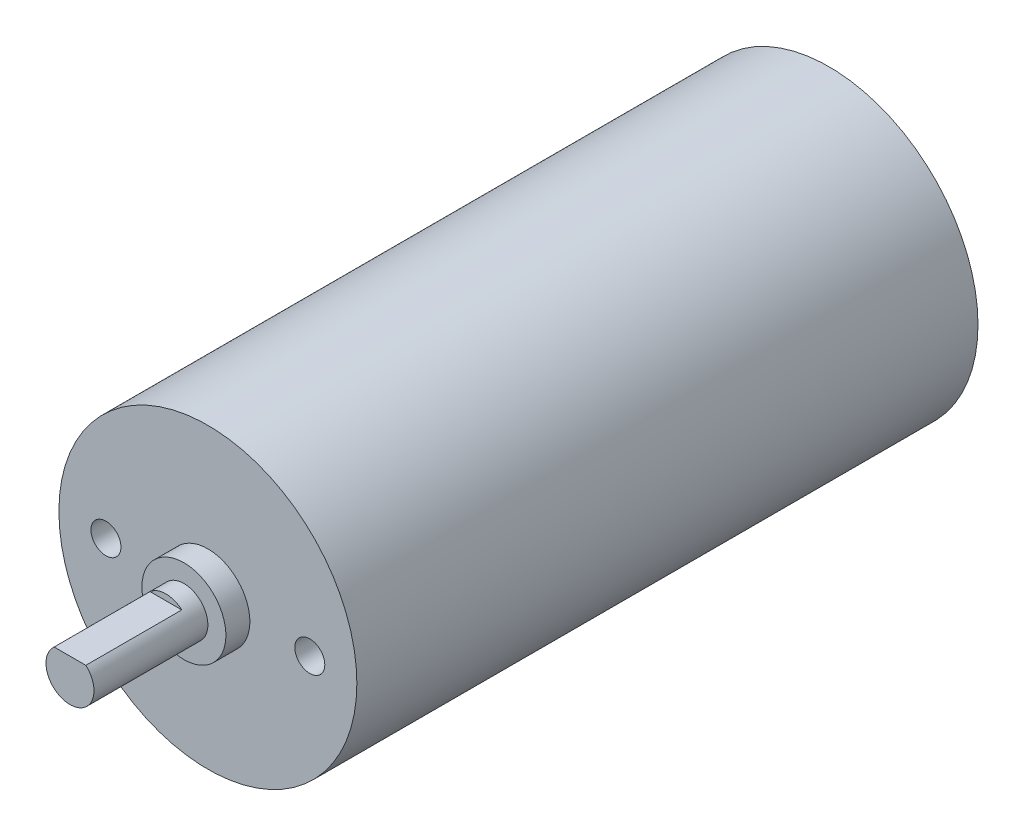
ISO-10303-21;
HEADER;
FILE_DESCRIPTION(('STEP AP214'),'2;1');
FILE_NAME('part.step','',(''),(''),'','','');
FILE_SCHEMA(('AUTOMOTIVE_DESIGN { 1 0 10303 214 1 1 1 1 }'));
ENDSEC;
DATA;
#1=APPLICATION_CONTEXT('core data for automotive mechanical design processes');
#2=APPLICATION_PROTOCOL_DEFINITION('international standard','automotive_design',2000,#1);
#3=PRODUCT_CONTEXT('',#1,'mechanical');
#4=PRODUCT('Part','Part','',(#3));
#5=PRODUCT_RELATED_PRODUCT_CATEGORY('part','',(#4));
#6=PRODUCT_DEFINITION_FORMATION('','',#4);
#7=PRODUCT_DEFINITION_CONTEXT('part definition',#1,'design');
#8=PRODUCT_DEFINITION('design','',#6,#7);
#9=PRODUCT_DEFINITION_SHAPE('','',#8);
#10=(LENGTH_UNIT() NAMED_UNIT(*) SI_UNIT(.MILLI.,.METRE.));
#11=(NAMED_UNIT(*) PLANE_ANGLE_UNIT() SI_UNIT($,.RADIAN.));
#12=(NAMED_UNIT(*) SI_UNIT($,.STERADIAN.) SOLID_ANGLE_UNIT());
#13=UNCERTAINTY_MEASURE_WITH_UNIT(LENGTH_MEASURE(1.E-05),#10,'distance_accuracy_value','');
#14=(GEOMETRIC_REPRESENTATION_CONTEXT(3) GLOBAL_UNCERTAINTY_ASSIGNED_CONTEXT((#13)) GLOBAL_UNIT_ASSIGNED_CONTEXT((#10,
#11,#12)) REPRESENTATION_CONTEXT('',''));
#15=CARTESIAN_POINT('',(0.,0.,0.));
#16=DIRECTION('',(0.,0.,1.));
#17=DIRECTION('',(1.,0.,0.));
#18=AXIS2_PLACEMENT_3D('',#15,#16,#17);
#19=CARTESIAN_POINT('',(0.,0.,8.));
#20=DIRECTION('',(0.,0.,-1.));
#21=DIRECTION('',(-1.,0.,0.));
#22=AXIS2_PLACEMENT_3D('',#19,#20,#21);
#23=CYLINDRICAL_SURFACE('',#22,2.);
#24=DIRECTION('',(0.,0.,-1.));
#25=VECTOR('',#24,1.);
#26=CARTESIAN_POINT('',(-1.3228756555323,1.5,8.));
#27=LINE('',#26,#25);
#28=CARTESIAN_POINT('',(-1.3228756555323,1.5,8.));
#29=VERTEX_POINT('',#28);
#30=CARTESIAN_POINT('',(-1.3228756555323,1.5,0.));
#31=VERTEX_POINT('',#30);
#32=EDGE_CURVE('E57',#29,#31,#27,.T.);
#33=ORIENTED_EDGE('',*,*,#32,.T.);
#34=CARTESIAN_POINT('',(0.,0.,0.));
#35=DIRECTION('',(0.,0.,-1.));
#36=DIRECTION('',(-1.,0.,0.));
#37=AXIS2_PLACEMENT_3D('',#34,#35,#36);
#38=CIRCLE('',#37,2.);
#39=CARTESIAN_POINT('',(1.3228756555323,1.5,0.));
#40=VERTEX_POINT('',#39);
#41=EDGE_CURVE('E107',#31,#40,#38,.T.);
#42=ORIENTED_EDGE('',*,*,#41,.T.);
#43=DIRECTION('',(0.,0.,-1.));
#44=VECTOR('',#43,1.);
#45=CARTESIAN_POINT('',(1.3228756555323,1.5,8.));
#46=LINE('',#45,#44);
#47=CARTESIAN_POINT('',(1.3228756555323,1.5,8.));
#48=VERTEX_POINT('',#47);
#49=EDGE_CURVE('E11',#48,#40,#46,.T.);
#50=ORIENTED_EDGE('',*,*,#49,.F.);
#51=CARTESIAN_POINT('',(0.,0.,8.));
#52=DIRECTION('',(0.,0.,1.));
#53=DIRECTION('',(1.,0.,0.));
#54=AXIS2_PLACEMENT_3D('',#51,#52,#53);
#55=CIRCLE('',#54,2.);
#56=EDGE_CURVE('E116',#29,#48,#55,.T.);
#57=ORIENTED_EDGE('',*,*,#56,.F.);
#58=EDGE_LOOP('',(#33,#42,#50,#57));
#59=FACE_BOUND('',#58,.T.);
#60=CARTESIAN_POINT('',(0.,0.,-1.5));
#61=DIRECTION('',(0.,0.,-1.));
#62=DIRECTION('',(-1.,0.,0.));
#63=AXIS2_PLACEMENT_3D('',#60,#61,#62);
#64=CIRCLE('',#63,2.);
#65=CARTESIAN_POINT('',(-2.,0.,-1.5));
#66=VERTEX_POINT('',#65);
#67=EDGE_CURVE('E110',#66,#66,#64,.T.);
#68=ORIENTED_EDGE('',*,*,#67,.F.);
#69=EDGE_LOOP('',(#68));
#70=FACE_BOUND('',#69,.T.);
#71=ADVANCED_FACE('F49',(#59,#70),#23,.T.);
#72=CARTESIAN_POINT('',(-1.3228756555323,1.5,8.));
#73=DIRECTION('',(0.,-1.,0.));
#74=DIRECTION('',(0.,0.,-1.));
#75=AXIS2_PLACEMENT_3D('',#72,#73,#74);
#76=PLANE('',#75);
#77=DIRECTION('',(-1.,0.,0.));
#78=VECTOR('',#77,1.);
#79=CARTESIAN_POINT('',(-1.3228756555323,1.5,0.));
#80=LINE('',#79,#78);
#81=EDGE_CURVE('E113',#40,#31,#80,.T.);
#82=ORIENTED_EDGE('',*,*,#81,.T.);
#83=ORIENTED_EDGE('',*,*,#32,.F.);
#84=DIRECTION('',(-1.,0.,0.));
#85=VECTOR('',#84,1.);
#86=CARTESIAN_POINT('',(-1.3228756555323,1.5,8.));
#87=LINE('',#86,#85);
#88=EDGE_CURVE('E63',#48,#29,#87,.T.);
#89=ORIENTED_EDGE('',*,*,#88,.F.);
#90=ORIENTED_EDGE('',*,*,#49,.T.);
#91=EDGE_LOOP('',(#82,#83,#89,#90));
#92=FACE_BOUND('',#91,.T.);
#93=ADVANCED_FACE('F127',(#92),#76,.F.);
#94=CARTESIAN_POINT('',(0.,0.,8.));
#95=DIRECTION('',(0.,0.,1.));
#96=DIRECTION('',(1.,0.,0.));
#97=AXIS2_PLACEMENT_3D('',#94,#95,#96);
#98=PLANE('',#97);
#99=ORIENTED_EDGE('',*,*,#56,.T.);
#100=ORIENTED_EDGE('',*,*,#88,.T.);
#101=EDGE_LOOP('',(#99,#100));
#102=FACE_BOUND('',#101,.T.);
#103=ADVANCED_FACE('F132',(#102),#98,.T.);
#104=CARTESIAN_POINT('',(0.,0.,0.));
#105=DIRECTION('',(0.,0.,-1.));
#106=DIRECTION('',(-1.,0.,0.));
#107=AXIS2_PLACEMENT_3D('',#104,#105,#106);
#108=PLANE('',#107);
#109=ORIENTED_EDGE('',*,*,#81,.F.);
#110=ORIENTED_EDGE('',*,*,#41,.F.);
#111=EDGE_LOOP('',(#109,#110));
#112=FACE_BOUND('',#111,.T.);
#113=ADVANCED_FACE('F129',(#112),#108,.F.);
#114=CARTESIAN_POINT('',(0.,0.,-3.5));
#115=DIRECTION('',(0.,0.,1.));
#116=DIRECTION('',(1.,0.,0.));
#117=AXIS2_PLACEMENT_3D('',#114,#115,#116);
#118=CYLINDRICAL_SURFACE('',#117,3.5);
#119=CARTESIAN_POINT('',(0.,0.,-3.5));
#120=DIRECTION('',(0.,0.,-1.));
#121=DIRECTION('',(-1.,0.,0.));
#122=AXIS2_PLACEMENT_3D('',#119,#120,#121);
#123=CIRCLE('',#122,3.5);
#124=CARTESIAN_POINT('',(-3.5,0.,-3.5));
#125=VERTEX_POINT('',#124);
#126=EDGE_CURVE('E104',#125,#125,#123,.T.);
#127=ORIENTED_EDGE('',*,*,#126,.F.);
#128=EDGE_LOOP('',(#127));
#129=FACE_BOUND('',#128,.T.);
#130=CARTESIAN_POINT('',(0.,0.,-1.5));
#131=DIRECTION('',(0.,0.,-1.));
#132=DIRECTION('',(-1.,0.,0.));
#133=AXIS2_PLACEMENT_3D('',#130,#131,#132);
#134=CIRCLE('',#133,3.5);
#135=CARTESIAN_POINT('',(-3.5,0.,-1.5));
#136=VERTEX_POINT('',#135);
#137=EDGE_CURVE('E101',#136,#136,#134,.T.);
#138=ORIENTED_EDGE('',*,*,#137,.T.);
#139=EDGE_LOOP('',(#138));
#140=FACE_BOUND('',#139,.T.);
#141=ADVANCED_FACE('F131',(#129,#140),#118,.T.);
#142=CARTESIAN_POINT('',(0.,0.,-1.5));
#143=DIRECTION('',(0.,0.,-1.));
#144=DIRECTION('',(-1.,0.,0.));
#145=AXIS2_PLACEMENT_3D('',#142,#143,#144);
#146=PLANE('',#145);
#147=ORIENTED_EDGE('',*,*,#67,.T.);
#148=EDGE_LOOP('',(#147));
#149=FACE_BOUND('',#148,.T.);
#150=ORIENTED_EDGE('',*,*,#137,.F.);
#151=EDGE_LOOP('',(#150));
#152=FACE_BOUND('',#151,.T.);
#153=ADVANCED_FACE('F138',(#149,#152),#146,.F.);
#154=CARTESIAN_POINT('',(0.,0.,-55.3));
#155=DIRECTION('',(0.,0.,1.));
#156=DIRECTION('',(1.,0.,0.));
#157=AXIS2_PLACEMENT_3D('',#154,#155,#156);
#158=CYLINDRICAL_SURFACE('',#157,12.425);
#159=CARTESIAN_POINT('',(0.,0.,-55.3));
#160=DIRECTION('',(0.,0.,-1.));
#161=DIRECTION('',(-1.,0.,0.));
#162=AXIS2_PLACEMENT_3D('',#159,#160,#161);
#163=CIRCLE('',#162,12.425);
#164=CARTESIAN_POINT('',(12.425,0.,-55.3));
#165=VERTEX_POINT('',#164);
#166=EDGE_CURVE('E98',#165,#165,#163,.T.);
#167=CARTESIAN_POINT('',(0.,0.,-3.5));
#168=DIRECTION('',(0.,0.,-1.));
#169=DIRECTION('',(-1.,0.,0.));
#170=AXIS2_PLACEMENT_3D('',#167,#168,#169);
#171=CIRCLE('',#170,12.425);
#172=CARTESIAN_POINT('',(12.425,0.,-3.5));
#173=VERTEX_POINT('',#172);
#174=EDGE_CURVE('E97',#173,#173,#171,.T.);
#175=CARTESIAN_POINT('',(12.425,0.,-55.3));
#176=CARTESIAN_POINT('',(12.425,0.,-54.7604166666667));
#177=CARTESIAN_POINT('',(12.425,0.,-54.2208333333333));
#178=CARTESIAN_POINT('',(12.425,0.,-53.1416666666667));
#179=CARTESIAN_POINT('',(12.425,0.,-52.6020833333333));
#180=CARTESIAN_POINT('',(12.425,0.,-51.5229166666667));
#181=CARTESIAN_POINT('',(12.425,0.,-50.9833333333333));
#182=CARTESIAN_POINT('',(12.425,0.,-49.9041666666667));
#183=CARTESIAN_POINT('',(12.425,0.,-49.3645833333333));
#184=CARTESIAN_POINT('',(12.425,0.,-48.2854166666667));
#185=CARTESIAN_POINT('',(12.425,0.,-47.7458333333333));
#186=CARTESIAN_POINT('',(12.425,0.,-46.6666666666667));
#187=CARTESIAN_POINT('',(12.425,0.,-46.1270833333333));
#188=CARTESIAN_POINT('',(12.425,0.,-45.0479166666667));
#189=CARTESIAN_POINT('',(12.425,0.,-44.5083333333333));
#190=CARTESIAN_POINT('',(12.425,0.,-43.4291666666667));
#191=CARTESIAN_POINT('',(12.425,0.,-42.8895833333333));
#192=CARTESIAN_POINT('',(12.425,0.,-41.8104166666667));
#193=CARTESIAN_POINT('',(12.425,0.,-41.2708333333333));
#194=CARTESIAN_POINT('',(12.425,0.,-40.1916666666667));
#195=CARTESIAN_POINT('',(12.425,0.,-39.6520833333333));
#196=CARTESIAN_POINT('',(12.425,0.,-38.5729166666667));
#197=CARTESIAN_POINT('',(12.425,0.,-38.0333333333333));
#198=CARTESIAN_POINT('',(12.425,0.,-36.9541666666667));
#199=CARTESIAN_POINT('',(12.425,0.,-36.4145833333333));
#200=CARTESIAN_POINT('',(12.425,0.,-35.3354166666667));
#201=CARTESIAN_POINT('',(12.425,0.,-34.7958333333333));
#202=CARTESIAN_POINT('',(12.425,0.,-33.7166666666667));
#203=CARTESIAN_POINT('',(12.425,0.,-33.1770833333333));
#204=CARTESIAN_POINT('',(12.425,0.,-32.0979166666667));
#205=CARTESIAN_POINT('',(12.425,0.,-31.5583333333333));
#206=CARTESIAN_POINT('',(12.425,0.,-30.4791666666667));
#207=CARTESIAN_POINT('',(12.425,0.,-29.9395833333333));
#208=CARTESIAN_POINT('',(12.425,0.,-28.8604166666667));
#209=CARTESIAN_POINT('',(12.425,0.,-28.3208333333333));
#210=CARTESIAN_POINT('',(12.425,0.,-27.2416666666667));
#211=CARTESIAN_POINT('',(12.425,0.,-26.7020833333333));
#212=CARTESIAN_POINT('',(12.425,0.,-25.6229166666667));
#213=CARTESIAN_POINT('',(12.425,0.,-25.0833333333333));
#214=CARTESIAN_POINT('',(12.425,0.,-24.0041666666667));
#215=CARTESIAN_POINT('',(12.425,0.,-23.4645833333333));
#216=CARTESIAN_POINT('',(12.425,0.,-22.3854166666667));
#217=CARTESIAN_POINT('',(12.425,0.,-21.8458333333333));
#218=CARTESIAN_POINT('',(12.425,0.,-20.7666666666667));
#219=CARTESIAN_POINT('',(12.425,0.,-20.2270833333333));
#220=CARTESIAN_POINT('',(12.425,0.,-19.1479166666667));
#221=CARTESIAN_POINT('',(12.425,0.,-18.6083333333333));
#222=CARTESIAN_POINT('',(12.425,0.,-17.5291666666667));
#223=CARTESIAN_POINT('',(12.425,0.,-16.9895833333333));
#224=CARTESIAN_POINT('',(12.425,0.,-15.9104166666667));
#225=CARTESIAN_POINT('',(12.425,0.,-15.3708333333333));
#226=CARTESIAN_POINT('',(12.425,0.,-14.2916666666667));
#227=CARTESIAN_POINT('',(12.425,0.,-13.7520833333333));
#228=CARTESIAN_POINT('',(12.425,0.,-12.6729166666667));
#229=CARTESIAN_POINT('',(12.425,0.,-12.1333333333333));
#230=CARTESIAN_POINT('',(12.425,0.,-11.0541666666667));
#231=CARTESIAN_POINT('',(12.425,0.,-10.5145833333333));
#232=CARTESIAN_POINT('',(12.425,0.,-9.43541666666666));
#233=CARTESIAN_POINT('',(12.425,0.,-8.89583333333333));
#234=CARTESIAN_POINT('',(12.425,0.,-7.81666666666666));
#235=CARTESIAN_POINT('',(12.425,0.,-7.27708333333333));
#236=CARTESIAN_POINT('',(12.425,0.,-6.19791666666667));
#237=CARTESIAN_POINT('',(12.425,0.,-5.65833333333333));
#238=CARTESIAN_POINT('',(12.425,0.,-4.57916666666666));
#239=CARTESIAN_POINT('',(12.425,0.,-4.03958333333333));
#240=CARTESIAN_POINT('',(12.425,0.,-3.5));
#241=B_SPLINE_CURVE_WITH_KNOTS('',3,(#175,#176,#177,#178,#179,#180,#181,#182,#183,#184,#185,
#186,#187,#188,#189,#190,#191,#192,#193,#194,#195,#196,#197,#198,#199,#200,#201,#202,#203,#204,
#205,#206,#207,#208,#209,#210,#211,#212,#213,#214,#215,#216,#217,#218,#219,#220,#221,#222,#223,
#224,#225,#226,#227,#228,#229,#230,#231,#232,#233,#234,#235,#236,#237,#238,#239,#240),
.UNSPECIFIED.,.F.,.F.,(4,2,2,2,2,2,2,2,2,2,2,2,2,2,2,2,2,2,2,2,2,2,2,2,2,2,2,2,2,2,2,2,4),(0.,
1.61875,3.2375,4.85625000000001,6.475,8.09375,9.71250000000001,11.33125,12.95,14.56875,16.1875,
17.80625,19.425,21.04375,22.6625,24.28125,25.9,27.51875,29.1375,30.75625,32.375,33.99375,
35.6125,37.23125,38.85,40.46875,42.0875,43.70625,45.325,46.94375,48.5625,50.18125,51.8),.UNSPECIFIED.);
#242=EDGE_CURVE('BSEAM172',#165,#173,#241,.T.);
#243=ORIENTED_EDGE('',*,*,#166,.F.);
#244=ORIENTED_EDGE('',*,*,#174,.T.);
#245=ORIENTED_EDGE('',*,*,#242,.T.);
#246=ORIENTED_EDGE('',*,*,#242,.F.);
#247=EDGE_LOOP('',(#243,#245,#244,#246));
#248=FACE_BOUND('',#247,.T.);
#249=ADVANCED_FACE('F172',(#248),#158,.T.);
#250=CARTESIAN_POINT('',(0.,0.,-55.3));
#251=DIRECTION('',(0.,0.,-1.));
#252=DIRECTION('',(-1.,0.,0.));
#253=AXIS2_PLACEMENT_3D('',#250,#251,#252);
#254=PLANE('',#253);
#255=ORIENTED_EDGE('',*,*,#166,.T.);
#256=EDGE_LOOP('',(#255));
#257=FACE_BOUND('',#256,.T.);
#258=ADVANCED_FACE('F182',(#257),#254,.T.);
#259=CARTESIAN_POINT('',(0.,0.,-3.5));
#260=DIRECTION('',(0.,0.,-1.));
#261=DIRECTION('',(-1.,0.,0.));
#262=AXIS2_PLACEMENT_3D('',#259,#260,#261);
#263=PLANE('',#262);
#264=CARTESIAN_POINT('',(8.5,0.,-3.5));
#265=DIRECTION('',(0.,0.,1.));
#266=DIRECTION('',(1.,0.,0.));
#267=AXIS2_PLACEMENT_3D('',#264,#265,#266);
#268=CIRCLE('',#267,1.24999999999999);
#269=CARTESIAN_POINT('',(9.74999999999999,0.,-3.5));
#270=VERTEX_POINT('',#269);
#271=EDGE_CURVE('E87',#270,#270,#268,.T.);
#272=ORIENTED_EDGE('',*,*,#271,.F.);
#273=EDGE_LOOP('',(#272));
#274=FACE_BOUND('',#273,.T.);
#275=CARTESIAN_POINT('',(-8.5,0.,-3.5));
#276=DIRECTION('',(0.,0.,1.));
#277=DIRECTION('',(1.,0.,0.));
#278=AXIS2_PLACEMENT_3D('',#275,#276,#277);
#279=CIRCLE('',#278,1.24999999999999);
#280=CARTESIAN_POINT('',(-7.25000000000001,0.,-3.5));
#281=VERTEX_POINT('',#280);
#282=EDGE_CURVE('E86',#281,#281,#279,.T.);
#283=ORIENTED_EDGE('',*,*,#282,.F.);
#284=EDGE_LOOP('',(#283));
#285=FACE_BOUND('',#284,.T.);
#286=ORIENTED_EDGE('',*,*,#126,.T.);
#287=EDGE_LOOP('',(#286));
#288=FACE_BOUND('',#287,.T.);
#289=ORIENTED_EDGE('',*,*,#174,.F.);
#290=EDGE_LOOP('',(#289));
#291=FACE_BOUND('',#290,.T.);
#292=ADVANCED_FACE('F192',(#274,#285,#288,#291),#263,.F.);
#293=CARTESIAN_POINT('',(-8.5,0.,-16.2));
#294=DIRECTION('',(0.,0.,1.));
#295=DIRECTION('',(1.,0.,0.));
#296=AXIS2_PLACEMENT_3D('',#293,#294,#295);
#297=CONICAL_SURFACE('',#296,1.25,1.02974425867665);
#298=CARTESIAN_POINT('',(-8.5,0.,-16.9510757737845));
#299=VERTEX_POINT('',#298);
#300=VERTEX_LOOP('',#299);
#301=FACE_BOUND('',#300,.T.);
#302=CARTESIAN_POINT('',(-8.5,0.,-16.2));
#303=DIRECTION('',(0.,0.,1.));
#304=DIRECTION('',(1.,0.,0.));
#305=AXIS2_PLACEMENT_3D('',#302,#303,#304);
#306=CIRCLE('',#305,1.25);
#307=CARTESIAN_POINT('',(-7.25,0.,-16.2));
#308=VERTEX_POINT('',#307);
#309=EDGE_CURVE('E90',#308,#308,#306,.T.);
#310=ORIENTED_EDGE('',*,*,#309,.T.);
#311=EDGE_LOOP('',(#310));
#312=FACE_BOUND('',#311,.T.);
#313=ADVANCED_FACE('F203',(#301,#312),#297,.F.);
#314=CARTESIAN_POINT('',(-8.5,0.,-3.5));
#315=DIRECTION('',(0.,0.,1.));
#316=DIRECTION('',(1.,0.,0.));
#317=AXIS2_PLACEMENT_3D('',#314,#315,#316);
#318=CYLINDRICAL_SURFACE('',#317,1.24999999999999);
#319=ORIENTED_EDGE('',*,*,#309,.F.);
#320=EDGE_LOOP('',(#319));
#321=FACE_BOUND('',#320,.T.);
#322=ORIENTED_EDGE('',*,*,#282,.T.);
#323=EDGE_LOOP('',(#322));
#324=FACE_BOUND('',#323,.T.);
#325=ADVANCED_FACE('F80',(#321,#324),#318,.F.);
#326=CARTESIAN_POINT('',(8.5,0.,-16.2));
#327=DIRECTION('',(0.,0.,1.));
#328=DIRECTION('',(1.,0.,0.));
#329=AXIS2_PLACEMENT_3D('',#326,#327,#328);
#330=CONICAL_SURFACE('',#329,1.25,1.02974425867665);
#331=CARTESIAN_POINT('',(8.5,0.,-16.9510757737845));
#332=VERTEX_POINT('',#331);
#333=VERTEX_LOOP('',#332);
#334=FACE_BOUND('',#333,.T.);
#335=CARTESIAN_POINT('',(8.5,0.,-16.2));
#336=DIRECTION('',(0.,0.,1.));
#337=DIRECTION('',(1.,0.,0.));
#338=AXIS2_PLACEMENT_3D('',#335,#336,#337);
#339=CIRCLE('',#338,1.25);
#340=CARTESIAN_POINT('',(9.75,0.,-16.2));
#341=VERTEX_POINT('',#340);
#342=EDGE_CURVE('E84',#341,#341,#339,.T.);
#343=ORIENTED_EDGE('',*,*,#342,.T.);
#344=EDGE_LOOP('',(#343));
#345=FACE_BOUND('',#344,.T.);
#346=ADVANCED_FACE('F76',(#334,#345),#330,.F.);
#347=CARTESIAN_POINT('',(8.5,0.,-3.5));
#348=DIRECTION('',(0.,0.,1.));
#349=DIRECTION('',(1.,0.,0.));
#350=AXIS2_PLACEMENT_3D('',#347,#348,#349);
#351=CYLINDRICAL_SURFACE('',#350,1.24999999999999);
#352=ORIENTED_EDGE('',*,*,#342,.F.);
#353=EDGE_LOOP('',(#352));
#354=FACE_BOUND('',#353,.T.);
#355=ORIENTED_EDGE('',*,*,#271,.T.);
#356=EDGE_LOOP('',(#355));
#357=FACE_BOUND('',#356,.T.);
#358=ADVANCED_FACE('F79',(#354,#357),#351,.F.);
#359=CLOSED_SHELL('',(#71,#93,#103,#113,#141,#153,#249,#258,#292,#313,#325,#346,#358));
#360=MANIFOLD_SOLID_BREP('B2',#359);
#361=ADVANCED_BREP_SHAPE_REPRESENTATION('',(#18,#360),#14);
#362=SHAPE_DEFINITION_REPRESENTATION(#9,#361);
ENDSEC;
END-ISO-10303-21;
